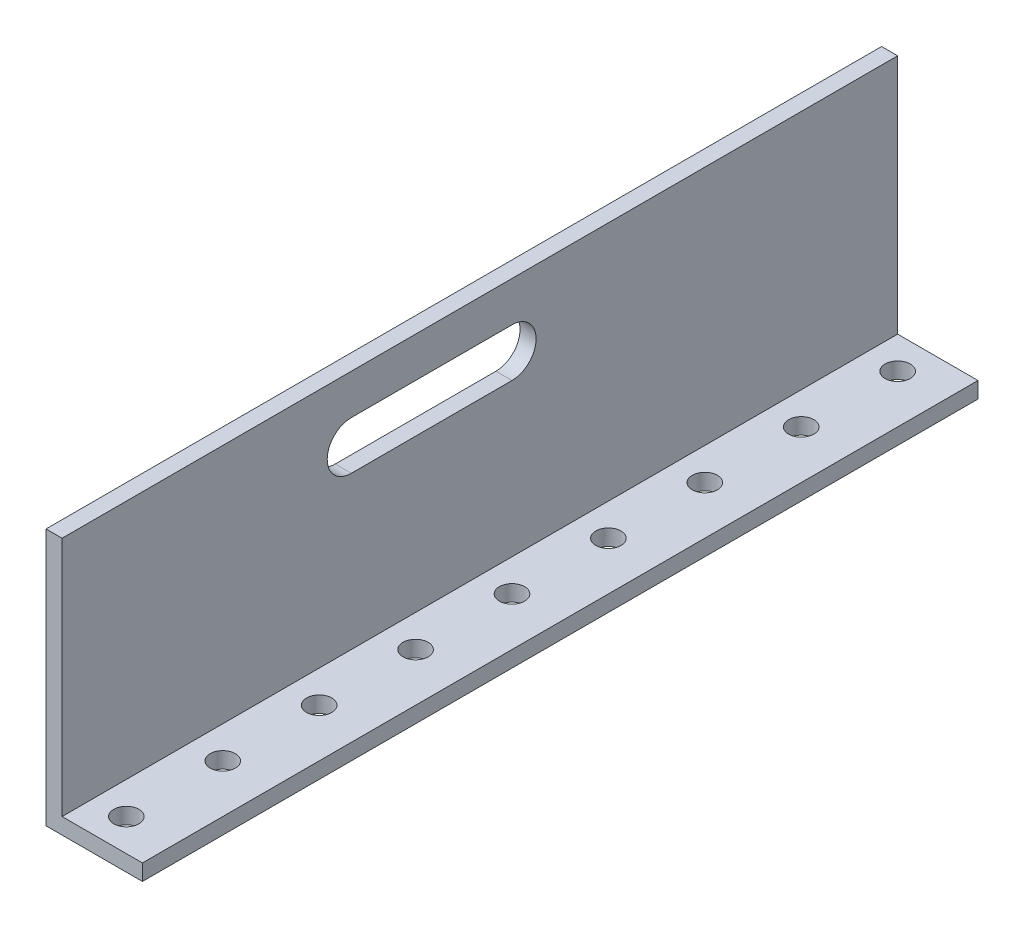
ISO-10303-21;
HEADER;
FILE_DESCRIPTION(('STEP AP214'),'2;1');
FILE_NAME('part.step','',(''),(''),'','','');
FILE_SCHEMA(('AUTOMOTIVE_DESIGN { 1 0 10303 214 1 1 1 1 }'));
ENDSEC;
DATA;
#1=APPLICATION_CONTEXT('core data for automotive mechanical design processes');
#2=APPLICATION_PROTOCOL_DEFINITION('international standard','automotive_design',2000,#1);
#3=PRODUCT_CONTEXT('',#1,'mechanical');
#4=PRODUCT('Part','Part','',(#3));
#5=PRODUCT_RELATED_PRODUCT_CATEGORY('part','',(#4));
#6=PRODUCT_DEFINITION_FORMATION('','',#4);
#7=PRODUCT_DEFINITION_CONTEXT('part definition',#1,'design');
#8=PRODUCT_DEFINITION('design','',#6,#7);
#9=PRODUCT_DEFINITION_SHAPE('','',#8);
#10=(LENGTH_UNIT() NAMED_UNIT(*) SI_UNIT(.MILLI.,.METRE.));
#11=(NAMED_UNIT(*) PLANE_ANGLE_UNIT() SI_UNIT($,.RADIAN.));
#12=(NAMED_UNIT(*) SI_UNIT($,.STERADIAN.) SOLID_ANGLE_UNIT());
#13=UNCERTAINTY_MEASURE_WITH_UNIT(LENGTH_MEASURE(1.E-05),#10,'distance_accuracy_value','');
#14=(GEOMETRIC_REPRESENTATION_CONTEXT(3) GLOBAL_UNCERTAINTY_ASSIGNED_CONTEXT((#13)) GLOBAL_UNIT_ASSIGNED_CONTEXT((#10,
#11,#12)) REPRESENTATION_CONTEXT('',''));
#15=CARTESIAN_POINT('',(0.,0.,0.));
#16=DIRECTION('',(0.,0.,1.));
#17=DIRECTION('',(1.,0.,0.));
#18=AXIS2_PLACEMENT_3D('',#15,#16,#17);
#19=CARTESIAN_POINT('',(0.,0.,165.1));
#20=DIRECTION('',(-1.,0.,0.));
#21=DIRECTION('',(0.,0.,1.));
#22=AXIS2_PLACEMENT_3D('',#19,#20,#21);
#23=PLANE('',#22);
#24=DIRECTION('',(0.,1.,0.));
#25=VECTOR('',#24,1.);
#26=CARTESIAN_POINT('',(0.,0.,0.));
#27=LINE('',#26,#25);
#28=CARTESIAN_POINT('',(0.,0.,0.));
#29=VERTEX_POINT('',#28);
#30=CARTESIAN_POINT('',(0.,50.8,0.));
#31=VERTEX_POINT('',#30);
#32=EDGE_CURVE('E232',#29,#31,#27,.T.);
#33=ORIENTED_EDGE('',*,*,#32,.F.);
#34=DIRECTION('',(0.,0.,-1.));
#35=VECTOR('',#34,1.);
#36=CARTESIAN_POINT('',(0.,0.,165.1));
#37=LINE('',#36,#35);
#38=CARTESIAN_POINT('',(0.,0.,165.1));
#39=VERTEX_POINT('',#38);
#40=EDGE_CURVE('E292',#39,#29,#37,.T.);
#41=ORIENTED_EDGE('',*,*,#40,.F.);
#42=DIRECTION('',(0.,1.,0.));
#43=VECTOR('',#42,1.);
#44=CARTESIAN_POINT('',(0.,0.,165.1));
#45=LINE('',#44,#43);
#46=CARTESIAN_POINT('',(0.,50.8,165.1));
#47=VERTEX_POINT('',#46);
#48=EDGE_CURVE('E233',#39,#47,#45,.T.);
#49=ORIENTED_EDGE('',*,*,#48,.T.);
#50=DIRECTION('',(0.,0.,-1.));
#51=VECTOR('',#50,1.);
#52=CARTESIAN_POINT('',(0.,50.8,165.1));
#53=LINE('',#52,#51);
#54=EDGE_CURVE('E255',#47,#31,#53,.T.);
#55=ORIENTED_EDGE('',*,*,#54,.T.);
#56=EDGE_LOOP('',(#33,#41,#49,#55));
#57=FACE_BOUND('',#56,.T.);
#58=CARTESIAN_POINT('',(0.,38.1,107.95));
#59=DIRECTION('',(-1.,0.,0.));
#60=DIRECTION('',(0.,0.,1.));
#61=AXIS2_PLACEMENT_3D('',#58,#59,#60);
#62=CIRCLE('',#61,4.7625);
#63=CARTESIAN_POINT('',(0.,33.3375,107.95));
#64=VERTEX_POINT('',#63);
#65=CARTESIAN_POINT('',(0.,42.8625,107.95));
#66=VERTEX_POINT('',#65);
#67=EDGE_CURVE('E138',#64,#66,#62,.T.);
#68=ORIENTED_EDGE('',*,*,#67,.F.);
#69=DIRECTION('',(0.,0.,-1.));
#70=VECTOR('',#69,1.);
#71=CARTESIAN_POINT('',(0.,33.3375,0.));
#72=LINE('',#71,#70);
#73=CARTESIAN_POINT('',(0.,33.3375,76.2));
#74=VERTEX_POINT('',#73);
#75=EDGE_CURVE('E64',#64,#74,#72,.T.);
#76=ORIENTED_EDGE('',*,*,#75,.T.);
#77=CARTESIAN_POINT('',(0.,38.1,76.2));
#78=DIRECTION('',(-1.,0.,0.));
#79=DIRECTION('',(0.,0.,1.));
#80=AXIS2_PLACEMENT_3D('',#77,#78,#79);
#81=CIRCLE('',#80,4.7625);
#82=CARTESIAN_POINT('',(0.,42.8625,76.2));
#83=VERTEX_POINT('',#82);
#84=EDGE_CURVE('E144',#83,#74,#81,.T.);
#85=ORIENTED_EDGE('',*,*,#84,.F.);
#86=DIRECTION('',(0.,0.,1.));
#87=VECTOR('',#86,1.);
#88=CARTESIAN_POINT('',(0.,42.8625,0.));
#89=LINE('',#88,#87);
#90=EDGE_CURVE('E128',#83,#66,#89,.T.);
#91=ORIENTED_EDGE('',*,*,#90,.T.);
#92=EDGE_LOOP('',(#68,#76,#85,#91));
#93=FACE_BOUND('',#92,.T.);
#94=ADVANCED_FACE('F49',(#57,#93),#23,.T.);
#95=CARTESIAN_POINT('',(3.175,0.,165.1));
#96=DIRECTION('',(-1.,0.,0.));
#97=DIRECTION('',(0.,0.,1.));
#98=AXIS2_PLACEMENT_3D('',#95,#96,#97);
#99=PLANE('',#98);
#100=DIRECTION('',(0.,1.,0.));
#101=VECTOR('',#100,1.);
#102=CARTESIAN_POINT('',(3.175,0.,0.));
#103=LINE('',#102,#101);
#104=CARTESIAN_POINT('',(3.175,3.175,0.));
#105=VERTEX_POINT('',#104);
#106=CARTESIAN_POINT('',(3.175,50.8,0.));
#107=VERTEX_POINT('',#106);
#108=EDGE_CURVE('E270',#105,#107,#103,.T.);
#109=ORIENTED_EDGE('',*,*,#108,.T.);
#110=DIRECTION('',(0.,0.,-1.));
#111=VECTOR('',#110,1.);
#112=CARTESIAN_POINT('',(3.175,50.8,165.1));
#113=LINE('',#112,#111);
#114=CARTESIAN_POINT('',(3.175,50.8,165.1));
#115=VERTEX_POINT('',#114);
#116=EDGE_CURVE('E279',#115,#107,#113,.T.);
#117=ORIENTED_EDGE('',*,*,#116,.F.);
#118=DIRECTION('',(0.,1.,0.));
#119=VECTOR('',#118,1.);
#120=CARTESIAN_POINT('',(3.175,0.,165.1));
#121=LINE('',#120,#119);
#122=CARTESIAN_POINT('',(3.175,3.175,165.1));
#123=VERTEX_POINT('',#122);
#124=EDGE_CURVE('E248',#123,#115,#121,.T.);
#125=ORIENTED_EDGE('',*,*,#124,.F.);
#126=DIRECTION('',(0.,0.,-1.));
#127=VECTOR('',#126,1.);
#128=CARTESIAN_POINT('',(3.175,3.175,165.1));
#129=LINE('',#128,#127);
#130=EDGE_CURVE('E282',#123,#105,#129,.T.);
#131=ORIENTED_EDGE('',*,*,#130,.T.);
#132=EDGE_LOOP('',(#109,#117,#125,#131));
#133=FACE_BOUND('',#132,.T.);
#134=DIRECTION('',(0.,0.,-1.));
#135=VECTOR('',#134,1.);
#136=CARTESIAN_POINT('',(3.175,33.3375,165.1));
#137=LINE('',#136,#135);
#138=CARTESIAN_POINT('',(3.17500000000001,33.3375,107.95));
#139=VERTEX_POINT('',#138);
#140=CARTESIAN_POINT('',(3.17500000000001,33.3375,76.2));
#141=VERTEX_POINT('',#140);
#142=EDGE_CURVE('E11',#139,#141,#137,.T.);
#143=ORIENTED_EDGE('',*,*,#142,.F.);
#144=CARTESIAN_POINT('',(3.17500000000001,38.1,107.95));
#145=DIRECTION('',(-1.,0.,0.));
#146=DIRECTION('',(0.,0.,1.));
#147=AXIS2_PLACEMENT_3D('',#144,#145,#146);
#148=CIRCLE('',#147,4.7625);
#149=CARTESIAN_POINT('',(3.17500000000001,42.8625,107.95));
#150=VERTEX_POINT('',#149);
#151=EDGE_CURVE('E295',#139,#150,#148,.T.);
#152=ORIENTED_EDGE('',*,*,#151,.T.);
#153=DIRECTION('',(0.,0.,1.));
#154=VECTOR('',#153,1.);
#155=CARTESIAN_POINT('',(3.175,42.8625,165.1));
#156=LINE('',#155,#154);
#157=CARTESIAN_POINT('',(3.17500000000001,42.8625,76.2));
#158=VERTEX_POINT('',#157);
#159=EDGE_CURVE('E131',#158,#150,#156,.T.);
#160=ORIENTED_EDGE('',*,*,#159,.F.);
#161=CARTESIAN_POINT('',(3.17500000000001,38.1,76.2));
#162=DIRECTION('',(-1.,0.,0.));
#163=DIRECTION('',(0.,0.,1.));
#164=AXIS2_PLACEMENT_3D('',#161,#162,#163);
#165=CIRCLE('',#164,4.7625);
#166=EDGE_CURVE('E57',#158,#141,#165,.T.);
#167=ORIENTED_EDGE('',*,*,#166,.T.);
#168=EDGE_LOOP('',(#143,#152,#160,#167));
#169=FACE_BOUND('',#168,.T.);
#170=ADVANCED_FACE('F305',(#133,#169),#99,.F.);
#171=CARTESIAN_POINT('',(0.,0.,165.1));
#172=DIRECTION('',(0.,1.,0.));
#173=DIRECTION('',(0.,0.,1.));
#174=AXIS2_PLACEMENT_3D('',#171,#172,#173);
#175=PLANE('',#174);
#176=CARTESIAN_POINT('',(9.525,0.,6.34999999999999));
#177=DIRECTION('',(0.,1.,0.));
#178=DIRECTION('',(0.,0.,1.));
#179=AXIS2_PLACEMENT_3D('',#176,#177,#178);
#180=CIRCLE('',#179,2.4892);
#181=CARTESIAN_POINT('',(9.525,0.,8.83919999999999));
#182=VERTEX_POINT('',#181);
#183=EDGE_CURVE('E228',#182,#182,#180,.T.);
#184=ORIENTED_EDGE('',*,*,#183,.T.);
#185=EDGE_LOOP('',(#184));
#186=FACE_BOUND('',#185,.T.);
#187=CARTESIAN_POINT('',(9.525,0.,25.4));
#188=DIRECTION('',(0.,1.,0.));
#189=DIRECTION('',(0.,0.,1.));
#190=AXIS2_PLACEMENT_3D('',#187,#188,#189);
#191=CIRCLE('',#190,2.4892);
#192=CARTESIAN_POINT('',(9.525,0.,27.8892));
#193=VERTEX_POINT('',#192);
#194=EDGE_CURVE('E224',#193,#193,#191,.T.);
#195=ORIENTED_EDGE('',*,*,#194,.T.);
#196=EDGE_LOOP('',(#195));
#197=FACE_BOUND('',#196,.T.);
#198=CARTESIAN_POINT('',(9.525,0.,44.45));
#199=DIRECTION('',(0.,1.,0.));
#200=DIRECTION('',(0.,0.,1.));
#201=AXIS2_PLACEMENT_3D('',#198,#199,#200);
#202=CIRCLE('',#201,2.4892);
#203=CARTESIAN_POINT('',(9.525,0.,46.9392));
#204=VERTEX_POINT('',#203);
#205=EDGE_CURVE('E220',#204,#204,#202,.T.);
#206=ORIENTED_EDGE('',*,*,#205,.T.);
#207=EDGE_LOOP('',(#206));
#208=FACE_BOUND('',#207,.T.);
#209=CARTESIAN_POINT('',(9.525,0.,63.5));
#210=DIRECTION('',(0.,1.,0.));
#211=DIRECTION('',(0.,0.,1.));
#212=AXIS2_PLACEMENT_3D('',#209,#210,#211);
#213=CIRCLE('',#212,2.4892);
#214=CARTESIAN_POINT('',(9.525,0.,65.9892));
#215=VERTEX_POINT('',#214);
#216=EDGE_CURVE('E216',#215,#215,#213,.T.);
#217=ORIENTED_EDGE('',*,*,#216,.T.);
#218=EDGE_LOOP('',(#217));
#219=FACE_BOUND('',#218,.T.);
#220=CARTESIAN_POINT('',(9.525,0.,82.55));
#221=DIRECTION('',(0.,1.,0.));
#222=DIRECTION('',(0.,0.,1.));
#223=AXIS2_PLACEMENT_3D('',#220,#221,#222);
#224=CIRCLE('',#223,2.4892);
#225=CARTESIAN_POINT('',(9.525,0.,85.0392));
#226=VERTEX_POINT('',#225);
#227=EDGE_CURVE('E212',#226,#226,#224,.T.);
#228=ORIENTED_EDGE('',*,*,#227,.T.);
#229=EDGE_LOOP('',(#228));
#230=FACE_BOUND('',#229,.T.);
#231=CARTESIAN_POINT('',(9.525,0.,101.6));
#232=DIRECTION('',(0.,1.,0.));
#233=DIRECTION('',(0.,0.,1.));
#234=AXIS2_PLACEMENT_3D('',#231,#232,#233);
#235=CIRCLE('',#234,2.4892);
#236=CARTESIAN_POINT('',(9.525,0.,104.0892));
#237=VERTEX_POINT('',#236);
#238=EDGE_CURVE('E208',#237,#237,#235,.T.);
#239=ORIENTED_EDGE('',*,*,#238,.T.);
#240=EDGE_LOOP('',(#239));
#241=FACE_BOUND('',#240,.T.);
#242=CARTESIAN_POINT('',(9.525,0.,120.65));
#243=DIRECTION('',(0.,1.,0.));
#244=DIRECTION('',(0.,0.,1.));
#245=AXIS2_PLACEMENT_3D('',#242,#243,#244);
#246=CIRCLE('',#245,2.4892);
#247=CARTESIAN_POINT('',(9.525,0.,123.1392));
#248=VERTEX_POINT('',#247);
#249=EDGE_CURVE('E204',#248,#248,#246,.T.);
#250=ORIENTED_EDGE('',*,*,#249,.T.);
#251=EDGE_LOOP('',(#250));
#252=FACE_BOUND('',#251,.T.);
#253=CARTESIAN_POINT('',(9.525,0.,139.7));
#254=DIRECTION('',(0.,1.,0.));
#255=DIRECTION('',(0.,0.,1.));
#256=AXIS2_PLACEMENT_3D('',#253,#254,#255);
#257=CIRCLE('',#256,2.48920000000001);
#258=CARTESIAN_POINT('',(9.525,0.,142.1892));
#259=VERTEX_POINT('',#258);
#260=EDGE_CURVE('E200',#259,#259,#257,.T.);
#261=ORIENTED_EDGE('',*,*,#260,.T.);
#262=EDGE_LOOP('',(#261));
#263=FACE_BOUND('',#262,.T.);
#264=CARTESIAN_POINT('',(9.525,0.,158.75));
#265=DIRECTION('',(0.,1.,0.));
#266=DIRECTION('',(0.,0.,1.));
#267=AXIS2_PLACEMENT_3D('',#264,#265,#266);
#268=CIRCLE('',#267,2.48920000000001);
#269=CARTESIAN_POINT('',(9.525,0.,161.2392));
#270=VERTEX_POINT('',#269);
#271=EDGE_CURVE('E165',#270,#270,#268,.T.);
#272=ORIENTED_EDGE('',*,*,#271,.T.);
#273=EDGE_LOOP('',(#272));
#274=FACE_BOUND('',#273,.T.);
#275=DIRECTION('',(1.,0.,0.));
#276=VECTOR('',#275,1.);
#277=CARTESIAN_POINT('',(0.,0.,0.));
#278=LINE('',#277,#276);
#279=CARTESIAN_POINT('',(19.05,0.,0.));
#280=VERTEX_POINT('',#279);
#281=EDGE_CURVE('E259',#29,#280,#278,.T.);
#282=ORIENTED_EDGE('',*,*,#281,.T.);
#283=DIRECTION('',(0.,0.,-1.));
#284=VECTOR('',#283,1.);
#285=CARTESIAN_POINT('',(19.05,0.,165.1));
#286=LINE('',#285,#284);
#287=CARTESIAN_POINT('',(19.05,0.,165.1));
#288=VERTEX_POINT('',#287);
#289=EDGE_CURVE('E288',#288,#280,#286,.T.);
#290=ORIENTED_EDGE('',*,*,#289,.F.);
#291=DIRECTION('',(1.,0.,0.));
#292=VECTOR('',#291,1.);
#293=CARTESIAN_POINT('',(0.,0.,165.1));
#294=LINE('',#293,#292);
#295=EDGE_CURVE('E237',#39,#288,#294,.T.);
#296=ORIENTED_EDGE('',*,*,#295,.F.);
#297=ORIENTED_EDGE('',*,*,#40,.T.);
#298=EDGE_LOOP('',(#282,#290,#296,#297));
#299=FACE_BOUND('',#298,.T.);
#300=ADVANCED_FACE('F327',(#186,#197,#208,#219,#230,#241,#252,#263,#274,#299),#175,.F.);
#301=CARTESIAN_POINT('',(19.05,0.,165.1));
#302=DIRECTION('',(-1.,0.,0.));
#303=DIRECTION('',(0.,0.,1.));
#304=AXIS2_PLACEMENT_3D('',#301,#302,#303);
#305=PLANE('',#304);
#306=DIRECTION('',(0.,1.,0.));
#307=VECTOR('',#306,1.);
#308=CARTESIAN_POINT('',(19.05,0.,0.));
#309=LINE('',#308,#307);
#310=CARTESIAN_POINT('',(19.05,3.175,0.));
#311=VERTEX_POINT('',#310);
#312=EDGE_CURVE('E262',#280,#311,#309,.T.);
#313=ORIENTED_EDGE('',*,*,#312,.T.);
#314=DIRECTION('',(0.,0.,-1.));
#315=VECTOR('',#314,1.);
#316=CARTESIAN_POINT('',(19.05,3.175,165.1));
#317=LINE('',#316,#315);
#318=CARTESIAN_POINT('',(19.05,3.175,165.1));
#319=VERTEX_POINT('',#318);
#320=EDGE_CURVE('E285',#319,#311,#317,.T.);
#321=ORIENTED_EDGE('',*,*,#320,.F.);
#322=DIRECTION('',(0.,1.,0.));
#323=VECTOR('',#322,1.);
#324=CARTESIAN_POINT('',(19.05,0.,165.1));
#325=LINE('',#324,#323);
#326=EDGE_CURVE('E241',#288,#319,#325,.T.);
#327=ORIENTED_EDGE('',*,*,#326,.F.);
#328=ORIENTED_EDGE('',*,*,#289,.T.);
#329=EDGE_LOOP('',(#313,#321,#327,#328));
#330=FACE_BOUND('',#329,.T.);
#331=ADVANCED_FACE('F350',(#330),#305,.F.);
#332=CARTESIAN_POINT('',(0.,3.175,165.1));
#333=DIRECTION('',(0.,1.,0.));
#334=DIRECTION('',(0.,0.,1.));
#335=AXIS2_PLACEMENT_3D('',#332,#333,#334);
#336=PLANE('',#335);
#337=CARTESIAN_POINT('',(9.525,3.175,6.34999999999999));
#338=DIRECTION('',(0.,1.,0.));
#339=DIRECTION('',(0.,0.,1.));
#340=AXIS2_PLACEMENT_3D('',#337,#338,#339);
#341=CIRCLE('',#340,2.4892);
#342=CARTESIAN_POINT('',(9.525,3.175,8.83919999999999));
#343=VERTEX_POINT('',#342);
#344=EDGE_CURVE('E161',#343,#343,#341,.T.);
#345=ORIENTED_EDGE('',*,*,#344,.F.);
#346=EDGE_LOOP('',(#345));
#347=FACE_BOUND('',#346,.T.);
#348=CARTESIAN_POINT('',(9.525,3.175,25.4));
#349=DIRECTION('',(0.,1.,0.));
#350=DIRECTION('',(0.,0.,1.));
#351=AXIS2_PLACEMENT_3D('',#348,#349,#350);
#352=CIRCLE('',#351,2.4892);
#353=CARTESIAN_POINT('',(9.525,3.175,27.8892));
#354=VERTEX_POINT('',#353);
#355=EDGE_CURVE('E166',#354,#354,#352,.T.);
#356=ORIENTED_EDGE('',*,*,#355,.F.);
#357=EDGE_LOOP('',(#356));
#358=FACE_BOUND('',#357,.T.);
#359=CARTESIAN_POINT('',(9.525,3.175,44.45));
#360=DIRECTION('',(0.,1.,0.));
#361=DIRECTION('',(0.,0.,1.));
#362=AXIS2_PLACEMENT_3D('',#359,#360,#361);
#363=CIRCLE('',#362,2.4892);
#364=CARTESIAN_POINT('',(9.525,3.175,46.9392));
#365=VERTEX_POINT('',#364);
#366=EDGE_CURVE('E170',#365,#365,#363,.T.);
#367=ORIENTED_EDGE('',*,*,#366,.F.);
#368=EDGE_LOOP('',(#367));
#369=FACE_BOUND('',#368,.T.);
#370=CARTESIAN_POINT('',(9.525,3.175,63.5));
#371=DIRECTION('',(0.,1.,0.));
#372=DIRECTION('',(0.,0.,1.));
#373=AXIS2_PLACEMENT_3D('',#370,#371,#372);
#374=CIRCLE('',#373,2.4892);
#375=CARTESIAN_POINT('',(9.525,3.175,65.9892));
#376=VERTEX_POINT('',#375);
#377=EDGE_CURVE('E174',#376,#376,#374,.T.);
#378=ORIENTED_EDGE('',*,*,#377,.F.);
#379=EDGE_LOOP('',(#378));
#380=FACE_BOUND('',#379,.T.);
#381=CARTESIAN_POINT('',(9.525,3.175,82.55));
#382=DIRECTION('',(0.,1.,0.));
#383=DIRECTION('',(0.,0.,1.));
#384=AXIS2_PLACEMENT_3D('',#381,#382,#383);
#385=CIRCLE('',#384,2.4892);
#386=CARTESIAN_POINT('',(9.525,3.175,85.0392));
#387=VERTEX_POINT('',#386);
#388=EDGE_CURVE('E178',#387,#387,#385,.T.);
#389=ORIENTED_EDGE('',*,*,#388,.F.);
#390=EDGE_LOOP('',(#389));
#391=FACE_BOUND('',#390,.T.);
#392=CARTESIAN_POINT('',(9.525,3.175,101.6));
#393=DIRECTION('',(0.,1.,0.));
#394=DIRECTION('',(0.,0.,1.));
#395=AXIS2_PLACEMENT_3D('',#392,#393,#394);
#396=CIRCLE('',#395,2.4892);
#397=CARTESIAN_POINT('',(9.525,3.175,104.0892));
#398=VERTEX_POINT('',#397);
#399=EDGE_CURVE('E182',#398,#398,#396,.T.);
#400=ORIENTED_EDGE('',*,*,#399,.F.);
#401=EDGE_LOOP('',(#400));
#402=FACE_BOUND('',#401,.T.);
#403=CARTESIAN_POINT('',(9.525,3.175,120.65));
#404=DIRECTION('',(0.,1.,0.));
#405=DIRECTION('',(0.,0.,1.));
#406=AXIS2_PLACEMENT_3D('',#403,#404,#405);
#407=CIRCLE('',#406,2.4892);
#408=CARTESIAN_POINT('',(9.525,3.175,123.1392));
#409=VERTEX_POINT('',#408);
#410=EDGE_CURVE('E186',#409,#409,#407,.T.);
#411=ORIENTED_EDGE('',*,*,#410,.F.);
#412=EDGE_LOOP('',(#411));
#413=FACE_BOUND('',#412,.T.);
#414=CARTESIAN_POINT('',(9.525,3.175,139.7));
#415=DIRECTION('',(0.,1.,0.));
#416=DIRECTION('',(0.,0.,1.));
#417=AXIS2_PLACEMENT_3D('',#414,#415,#416);
#418=CIRCLE('',#417,2.48920000000001);
#419=CARTESIAN_POINT('',(9.525,3.175,142.1892));
#420=VERTEX_POINT('',#419);
#421=EDGE_CURVE('E190',#420,#420,#418,.T.);
#422=ORIENTED_EDGE('',*,*,#421,.F.);
#423=EDGE_LOOP('',(#422));
#424=FACE_BOUND('',#423,.T.);
#425=CARTESIAN_POINT('',(9.525,3.175,158.75));
#426=DIRECTION('',(0.,1.,0.));
#427=DIRECTION('',(0.,0.,1.));
#428=AXIS2_PLACEMENT_3D('',#425,#426,#427);
#429=CIRCLE('',#428,2.48920000000001);
#430=CARTESIAN_POINT('',(9.525,3.175,161.2392));
#431=VERTEX_POINT('',#430);
#432=EDGE_CURVE('E156',#431,#431,#429,.T.);
#433=ORIENTED_EDGE('',*,*,#432,.F.);
#434=EDGE_LOOP('',(#433));
#435=FACE_BOUND('',#434,.T.);
#436=DIRECTION('',(1.,0.,0.));
#437=VECTOR('',#436,1.);
#438=CARTESIAN_POINT('',(0.,3.175,0.));
#439=LINE('',#438,#437);
#440=EDGE_CURVE('E266',#105,#311,#439,.T.);
#441=ORIENTED_EDGE('',*,*,#440,.F.);
#442=ORIENTED_EDGE('',*,*,#130,.F.);
#443=DIRECTION('',(1.,0.,0.));
#444=VECTOR('',#443,1.);
#445=CARTESIAN_POINT('',(0.,3.175,165.1));
#446=LINE('',#445,#444);
#447=EDGE_CURVE('E244',#123,#319,#446,.T.);
#448=ORIENTED_EDGE('',*,*,#447,.T.);
#449=ORIENTED_EDGE('',*,*,#320,.T.);
#450=EDGE_LOOP('',(#441,#442,#448,#449));
#451=FACE_BOUND('',#450,.T.);
#452=ADVANCED_FACE('F345',(#347,#358,#369,#380,#391,#402,#413,#424,#435,#451),#336,.T.);
#453=CARTESIAN_POINT('',(0.,50.8,165.1));
#454=DIRECTION('',(0.,1.,0.));
#455=DIRECTION('',(0.,0.,1.));
#456=AXIS2_PLACEMENT_3D('',#453,#454,#455);
#457=PLANE('',#456);
#458=DIRECTION('',(1.,0.,0.));
#459=VECTOR('',#458,1.);
#460=CARTESIAN_POINT('',(0.,50.8,0.));
#461=LINE('',#460,#459);
#462=EDGE_CURVE('E238',#31,#107,#461,.T.);
#463=ORIENTED_EDGE('',*,*,#462,.F.);
#464=ORIENTED_EDGE('',*,*,#54,.F.);
#465=DIRECTION('',(1.,0.,0.));
#466=VECTOR('',#465,1.);
#467=CARTESIAN_POINT('',(0.,50.8,165.1));
#468=LINE('',#467,#466);
#469=EDGE_CURVE('E251',#47,#115,#468,.T.);
#470=ORIENTED_EDGE('',*,*,#469,.T.);
#471=ORIENTED_EDGE('',*,*,#116,.T.);
#472=EDGE_LOOP('',(#463,#464,#470,#471));
#473=FACE_BOUND('',#472,.T.);
#474=ADVANCED_FACE('F339',(#473),#457,.T.);
#475=CARTESIAN_POINT('',(0.,0.,165.1));
#476=DIRECTION('',(0.,0.,1.));
#477=DIRECTION('',(1.,0.,0.));
#478=AXIS2_PLACEMENT_3D('',#475,#476,#477);
#479=PLANE('',#478);
#480=ORIENTED_EDGE('',*,*,#48,.F.);
#481=ORIENTED_EDGE('',*,*,#295,.T.);
#482=ORIENTED_EDGE('',*,*,#326,.T.);
#483=ORIENTED_EDGE('',*,*,#447,.F.);
#484=ORIENTED_EDGE('',*,*,#124,.T.);
#485=ORIENTED_EDGE('',*,*,#469,.F.);
#486=EDGE_LOOP('',(#480,#481,#482,#483,#484,#485));
#487=FACE_BOUND('',#486,.T.);
#488=ADVANCED_FACE('F355',(#487),#479,.T.);
#489=CARTESIAN_POINT('',(0.,0.,0.));
#490=DIRECTION('',(0.,0.,1.));
#491=DIRECTION('',(1.,0.,0.));
#492=AXIS2_PLACEMENT_3D('',#489,#490,#491);
#493=PLANE('',#492);
#494=ORIENTED_EDGE('',*,*,#32,.T.);
#495=ORIENTED_EDGE('',*,*,#462,.T.);
#496=ORIENTED_EDGE('',*,*,#108,.F.);
#497=ORIENTED_EDGE('',*,*,#440,.T.);
#498=ORIENTED_EDGE('',*,*,#312,.F.);
#499=ORIENTED_EDGE('',*,*,#281,.F.);
#500=EDGE_LOOP('',(#494,#495,#496,#497,#498,#499));
#501=FACE_BOUND('',#500,.T.);
#502=ADVANCED_FACE('F335',(#501),#493,.F.);
#503=CARTESIAN_POINT('',(9.525,-161.925,158.75));
#504=DIRECTION('',(0.,1.,0.));
#505=DIRECTION('',(0.,0.,1.));
#506=AXIS2_PLACEMENT_3D('',#503,#504,#505);
#507=CYLINDRICAL_SURFACE('',#506,2.48920000000001);
#508=ORIENTED_EDGE('',*,*,#432,.T.);
#509=EDGE_LOOP('',(#508));
#510=FACE_BOUND('',#509,.T.);
#511=ORIENTED_EDGE('',*,*,#271,.F.);
#512=EDGE_LOOP('',(#511));
#513=FACE_BOUND('',#512,.T.);
#514=ADVANCED_FACE('F362',(#510,#513),#507,.F.);
#515=CARTESIAN_POINT('',(9.525,-161.925,139.7));
#516=DIRECTION('',(0.,1.,0.));
#517=DIRECTION('',(0.,0.,1.));
#518=AXIS2_PLACEMENT_3D('',#515,#516,#517);
#519=CYLINDRICAL_SURFACE('',#518,2.48920000000001);
#520=ORIENTED_EDGE('',*,*,#421,.T.);
#521=EDGE_LOOP('',(#520));
#522=FACE_BOUND('',#521,.T.);
#523=ORIENTED_EDGE('',*,*,#260,.F.);
#524=EDGE_LOOP('',(#523));
#525=FACE_BOUND('',#524,.T.);
#526=ADVANCED_FACE('F395',(#522,#525),#519,.F.);
#527=CARTESIAN_POINT('',(9.525,-161.925,120.65));
#528=DIRECTION('',(0.,1.,0.));
#529=DIRECTION('',(0.,0.,1.));
#530=AXIS2_PLACEMENT_3D('',#527,#528,#529);
#531=CYLINDRICAL_SURFACE('',#530,2.4892);
#532=ORIENTED_EDGE('',*,*,#410,.T.);
#533=EDGE_LOOP('',(#532));
#534=FACE_BOUND('',#533,.T.);
#535=ORIENTED_EDGE('',*,*,#249,.F.);
#536=EDGE_LOOP('',(#535));
#537=FACE_BOUND('',#536,.T.);
#538=ADVANCED_FACE('F400',(#534,#537),#531,.F.);
#539=CARTESIAN_POINT('',(9.525,-161.925,101.6));
#540=DIRECTION('',(0.,1.,0.));
#541=DIRECTION('',(0.,0.,1.));
#542=AXIS2_PLACEMENT_3D('',#539,#540,#541);
#543=CYLINDRICAL_SURFACE('',#542,2.4892);
#544=ORIENTED_EDGE('',*,*,#399,.T.);
#545=EDGE_LOOP('',(#544));
#546=FACE_BOUND('',#545,.T.);
#547=ORIENTED_EDGE('',*,*,#238,.F.);
#548=EDGE_LOOP('',(#547));
#549=FACE_BOUND('',#548,.T.);
#550=ADVANCED_FACE('F407',(#546,#549),#543,.F.);
#551=CARTESIAN_POINT('',(9.525,-161.925,82.55));
#552=DIRECTION('',(0.,1.,0.));
#553=DIRECTION('',(0.,0.,1.));
#554=AXIS2_PLACEMENT_3D('',#551,#552,#553);
#555=CYLINDRICAL_SURFACE('',#554,2.4892);
#556=ORIENTED_EDGE('',*,*,#388,.T.);
#557=EDGE_LOOP('',(#556));
#558=FACE_BOUND('',#557,.T.);
#559=ORIENTED_EDGE('',*,*,#227,.F.);
#560=EDGE_LOOP('',(#559));
#561=FACE_BOUND('',#560,.T.);
#562=ADVANCED_FACE('F414',(#558,#561),#555,.F.);
#563=CARTESIAN_POINT('',(9.525,-161.925,63.5));
#564=DIRECTION('',(0.,1.,0.));
#565=DIRECTION('',(0.,0.,1.));
#566=AXIS2_PLACEMENT_3D('',#563,#564,#565);
#567=CYLINDRICAL_SURFACE('',#566,2.4892);
#568=ORIENTED_EDGE('',*,*,#377,.T.);
#569=EDGE_LOOP('',(#568));
#570=FACE_BOUND('',#569,.T.);
#571=ORIENTED_EDGE('',*,*,#216,.F.);
#572=EDGE_LOOP('',(#571));
#573=FACE_BOUND('',#572,.T.);
#574=ADVANCED_FACE('F418',(#570,#573),#567,.F.);
#575=CARTESIAN_POINT('',(9.525,-161.925,44.45));
#576=DIRECTION('',(0.,1.,0.));
#577=DIRECTION('',(0.,0.,1.));
#578=AXIS2_PLACEMENT_3D('',#575,#576,#577);
#579=CYLINDRICAL_SURFACE('',#578,2.4892);
#580=ORIENTED_EDGE('',*,*,#366,.T.);
#581=EDGE_LOOP('',(#580));
#582=FACE_BOUND('',#581,.T.);
#583=ORIENTED_EDGE('',*,*,#205,.F.);
#584=EDGE_LOOP('',(#583));
#585=FACE_BOUND('',#584,.T.);
#586=ADVANCED_FACE('F422',(#582,#585),#579,.F.);
#587=CARTESIAN_POINT('',(9.525,-161.925,25.4));
#588=DIRECTION('',(0.,1.,0.));
#589=DIRECTION('',(0.,0.,1.));
#590=AXIS2_PLACEMENT_3D('',#587,#588,#589);
#591=CYLINDRICAL_SURFACE('',#590,2.4892);
#592=ORIENTED_EDGE('',*,*,#355,.T.);
#593=EDGE_LOOP('',(#592));
#594=FACE_BOUND('',#593,.T.);
#595=ORIENTED_EDGE('',*,*,#194,.F.);
#596=EDGE_LOOP('',(#595));
#597=FACE_BOUND('',#596,.T.);
#598=ADVANCED_FACE('F319',(#594,#597),#591,.F.);
#599=CARTESIAN_POINT('',(9.525,-161.925,6.34999999999999));
#600=DIRECTION('',(0.,1.,0.));
#601=DIRECTION('',(0.,0.,1.));
#602=AXIS2_PLACEMENT_3D('',#599,#600,#601);
#603=CYLINDRICAL_SURFACE('',#602,2.4892);
#604=ORIENTED_EDGE('',*,*,#344,.T.);
#605=EDGE_LOOP('',(#604));
#606=FACE_BOUND('',#605,.T.);
#607=ORIENTED_EDGE('',*,*,#183,.F.);
#608=EDGE_LOOP('',(#607));
#609=FACE_BOUND('',#608,.T.);
#610=ADVANCED_FACE('F311',(#606,#609),#603,.F.);
#611=CARTESIAN_POINT('',(184.15,33.3375,0.));
#612=DIRECTION('',(0.,1.,0.));
#613=DIRECTION('',(0.,0.,1.));
#614=AXIS2_PLACEMENT_3D('',#611,#612,#613);
#615=PLANE('',#614);
#616=ORIENTED_EDGE('',*,*,#142,.T.);
#617=DIRECTION('',(-1.,0.,0.));
#618=VECTOR('',#617,1.);
#619=CARTESIAN_POINT('',(184.15,33.3375,76.2));
#620=LINE('',#619,#618);
#621=EDGE_CURVE('E153',#141,#74,#620,.T.);
#622=ORIENTED_EDGE('',*,*,#621,.T.);
#623=ORIENTED_EDGE('',*,*,#75,.F.);
#624=DIRECTION('',(-1.,0.,0.));
#625=VECTOR('',#624,1.);
#626=CARTESIAN_POINT('',(184.15,33.3375,107.95));
#627=LINE('',#626,#625);
#628=EDGE_CURVE('E135',#139,#64,#627,.T.);
#629=ORIENTED_EDGE('',*,*,#628,.F.);
#630=EDGE_LOOP('',(#616,#622,#623,#629));
#631=FACE_BOUND('',#630,.T.);
#632=ADVANCED_FACE('F309',(#631),#615,.T.);
#633=CARTESIAN_POINT('',(184.15,38.1,76.2));
#634=DIRECTION('',(-1.,0.,0.));
#635=DIRECTION('',(0.,0.,1.));
#636=AXIS2_PLACEMENT_3D('',#633,#634,#635);
#637=CYLINDRICAL_SURFACE('',#636,4.7625);
#638=DIRECTION('',(-1.,0.,0.));
#639=VECTOR('',#638,1.);
#640=CARTESIAN_POINT('',(184.15,42.8625,76.2));
#641=LINE('',#640,#639);
#642=EDGE_CURVE('E134',#158,#83,#641,.T.);
#643=ORIENTED_EDGE('',*,*,#642,.T.);
#644=ORIENTED_EDGE('',*,*,#84,.T.);
#645=ORIENTED_EDGE('',*,*,#621,.F.);
#646=ORIENTED_EDGE('',*,*,#166,.F.);
#647=EDGE_LOOP('',(#643,#644,#645,#646));
#648=FACE_BOUND('',#647,.T.);
#649=ADVANCED_FACE('F308',(#648),#637,.F.);
#650=CARTESIAN_POINT('',(184.15,42.8625,0.));
#651=DIRECTION('',(0.,-1.,0.));
#652=DIRECTION('',(0.,0.,-1.));
#653=AXIS2_PLACEMENT_3D('',#650,#651,#652);
#654=PLANE('',#653);
#655=ORIENTED_EDGE('',*,*,#159,.T.);
#656=DIRECTION('',(-1.,0.,0.));
#657=VECTOR('',#656,1.);
#658=CARTESIAN_POINT('',(184.15,42.8625,107.95));
#659=LINE('',#658,#657);
#660=EDGE_CURVE('E72',#150,#66,#659,.T.);
#661=ORIENTED_EDGE('',*,*,#660,.T.);
#662=ORIENTED_EDGE('',*,*,#90,.F.);
#663=ORIENTED_EDGE('',*,*,#642,.F.);
#664=EDGE_LOOP('',(#655,#661,#662,#663));
#665=FACE_BOUND('',#664,.T.);
#666=ADVANCED_FACE('F125',(#665),#654,.T.);
#667=CARTESIAN_POINT('',(184.15,38.1,107.95));
#668=DIRECTION('',(-1.,0.,0.));
#669=DIRECTION('',(0.,0.,1.));
#670=AXIS2_PLACEMENT_3D('',#667,#668,#669);
#671=CYLINDRICAL_SURFACE('',#670,4.7625);
#672=ORIENTED_EDGE('',*,*,#628,.T.);
#673=ORIENTED_EDGE('',*,*,#67,.T.);
#674=ORIENTED_EDGE('',*,*,#660,.F.);
#675=ORIENTED_EDGE('',*,*,#151,.F.);
#676=EDGE_LOOP('',(#672,#673,#674,#675));
#677=FACE_BOUND('',#676,.T.);
#678=ADVANCED_FACE('F139',(#677),#671,.F.);
#679=CLOSED_SHELL('',(#94,#170,#300,#331,#452,#474,#488,#502,#514,#526,#538,#550,#562,#574,#586,
#598,#610,#632,#649,#666,#678));
#680=MANIFOLD_SOLID_BREP('B2',#679);
#681=ADVANCED_BREP_SHAPE_REPRESENTATION('',(#18,#680),#14);
#682=SHAPE_DEFINITION_REPRESENTATION(#9,#681);
ENDSEC;
END-ISO-10303-21;
